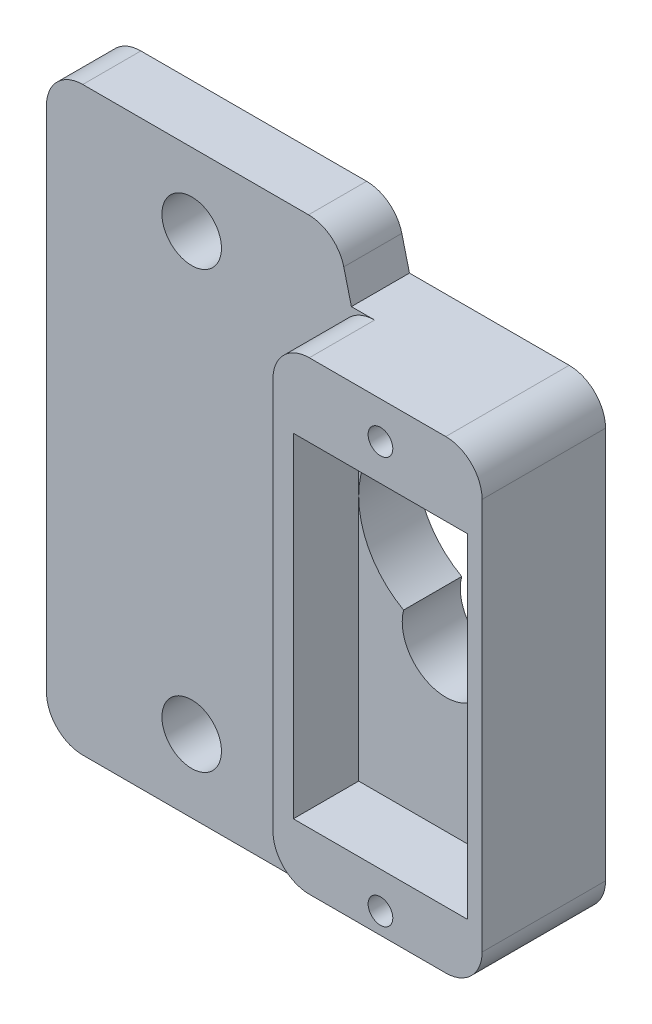
ISO-10303-21;
HEADER;
FILE_DESCRIPTION(('STEP AP214'),'2;1');
FILE_NAME('part.step','',(''),(''),'','','');
FILE_SCHEMA(('AUTOMOTIVE_DESIGN { 1 0 10303 214 1 1 1 1 }'));
ENDSEC;
DATA;
#1=APPLICATION_CONTEXT('core data for automotive mechanical design processes');
#2=APPLICATION_PROTOCOL_DEFINITION('international standard','automotive_design',2000,#1);
#3=PRODUCT_CONTEXT('',#1,'mechanical');
#4=PRODUCT('Part','Part','',(#3));
#5=PRODUCT_RELATED_PRODUCT_CATEGORY('part','',(#4));
#6=PRODUCT_DEFINITION_FORMATION('','',#4);
#7=PRODUCT_DEFINITION_CONTEXT('part definition',#1,'design');
#8=PRODUCT_DEFINITION('design','',#6,#7);
#9=PRODUCT_DEFINITION_SHAPE('','',#8);
#10=(LENGTH_UNIT() NAMED_UNIT(*) SI_UNIT(.MILLI.,.METRE.));
#11=(NAMED_UNIT(*) PLANE_ANGLE_UNIT() SI_UNIT($,.RADIAN.));
#12=(NAMED_UNIT(*) SI_UNIT($,.STERADIAN.) SOLID_ANGLE_UNIT());
#13=UNCERTAINTY_MEASURE_WITH_UNIT(LENGTH_MEASURE(1.E-05),#10,'distance_accuracy_value','');
#14=(GEOMETRIC_REPRESENTATION_CONTEXT(3) GLOBAL_UNCERTAINTY_ASSIGNED_CONTEXT((#13)) GLOBAL_UNIT_ASSIGNED_CONTEXT((#10,
#11,#12)) REPRESENTATION_CONTEXT('',''));
#15=CARTESIAN_POINT('',(0.,0.,0.));
#16=DIRECTION('',(0.,0.,1.));
#17=DIRECTION('',(1.,0.,0.));
#18=AXIS2_PLACEMENT_3D('',#15,#16,#17);
#19=CARTESIAN_POINT('',(40.,0.,4.));
#20=DIRECTION('',(0.,0.,1.));
#21=DIRECTION('',(-1.,0.,0.));
#22=AXIS2_PLACEMENT_3D('',#19,#20,#21);
#23=PLANE('',#22);
#24=CARTESIAN_POINT('',(47.5,4.95,4.));
#25=DIRECTION('',(0.,0.,-1.));
#26=DIRECTION('',(-1.,0.,0.));
#27=AXIS2_PLACEMENT_3D('',#24,#25,#26);
#28=CIRCLE('',#27,6.);
#29=CARTESIAN_POINT('',(47.5,10.95,4.));
#30=VERTEX_POINT('',#29);
#31=CARTESIAN_POINT('',(41.5,4.95,4.));
#32=VERTEX_POINT('',#31);
#33=EDGE_CURVE('E841',#30,#32,#28,.F.);
#34=ORIENTED_EDGE('',*,*,#33,.F.);
#35=DIRECTION('',(1.,0.,0.));
#36=VECTOR('',#35,1.);
#37=CARTESIAN_POINT('',(40.,10.95,4.));
#38=LINE('',#37,#36);
#39=CARTESIAN_POINT('',(41.5,10.95,4.));
#40=VERTEX_POINT('',#39);
#41=EDGE_CURVE('E268',#40,#30,#38,.T.);
#42=ORIENTED_EDGE('',*,*,#41,.F.);
#43=DIRECTION('',(0.,1.,0.));
#44=VECTOR('',#43,1.);
#45=CARTESIAN_POINT('',(41.5,0.,4.));
#46=LINE('',#45,#44);
#47=EDGE_CURVE('E276',#32,#40,#46,.T.);
#48=ORIENTED_EDGE('',*,*,#47,.F.);
#49=EDGE_LOOP('',(#34,#42,#48));
#50=FACE_BOUND('',#49,.T.);
#51=ADVANCED_FACE('F43',(#50),#23,.T.);
#52=CARTESIAN_POINT('',(53.5,4.95,4.));
#53=VERTEX_POINT('',#52);
#54=EDGE_CURVE('E302',#53,#30,#28,.F.);
#55=ORIENTED_EDGE('',*,*,#54,.F.);
#56=DIRECTION('',(0.,1.,0.));
#57=VECTOR('',#56,1.);
#58=CARTESIAN_POINT('',(53.5,0.,4.));
#59=LINE('',#58,#57);
#60=CARTESIAN_POINT('',(53.5,10.95,4.));
#61=VERTEX_POINT('',#60);
#62=EDGE_CURVE('E269',#53,#61,#59,.T.);
#63=ORIENTED_EDGE('',*,*,#62,.T.);
#64=EDGE_CURVE('E273',#30,#61,#38,.T.);
#65=ORIENTED_EDGE('',*,*,#64,.F.);
#66=EDGE_LOOP('',(#55,#63,#65));
#67=FACE_BOUND('',#66,.T.);
#68=ADVANCED_FACE('F513',(#67),#23,.T.);
#69=CARTESIAN_POINT('',(30.,-15.,4.));
#70=DIRECTION('',(0.,0.,-1.));
#71=DIRECTION('',(-1.,0.,0.));
#72=AXIS2_PLACEMENT_3D('',#69,#70,#71);
#73=CIRCLE('',#72,2.05);
#74=CARTESIAN_POINT('',(27.95,-15.,4.));
#75=VERTEX_POINT('',#74);
#76=EDGE_CURVE('E326',#75,#75,#73,.F.);
#77=ORIENTED_EDGE('',*,*,#76,.F.);
#78=EDGE_LOOP('',(#77));
#79=FACE_BOUND('',#78,.T.);
#80=CARTESIAN_POINT('',(30.,15.,4.));
#81=DIRECTION('',(0.,0.,-1.));
#82=DIRECTION('',(-1.,0.,0.));
#83=AXIS2_PLACEMENT_3D('',#80,#81,#82);
#84=CIRCLE('',#83,2.05);
#85=CARTESIAN_POINT('',(27.95,15.,4.));
#86=VERTEX_POINT('',#85);
#87=EDGE_CURVE('E323',#86,#86,#84,.T.);
#88=ORIENTED_EDGE('',*,*,#87,.T.);
#89=EDGE_LOOP('',(#88));
#90=FACE_BOUND('',#89,.T.);
#91=DIRECTION('',(-1.,0.,0.));
#92=VECTOR('',#91,1.);
#93=CARTESIAN_POINT('',(40.,20.,4.));
#94=LINE('',#93,#92);
#95=CARTESIAN_POINT('',(38.048058983989,20.,4.));
#96=VERTEX_POINT('',#95);
#97=CARTESIAN_POINT('',(22.5,20.,4.));
#98=VERTEX_POINT('',#97);
#99=EDGE_CURVE('E311',#96,#98,#94,.T.);
#100=ORIENTED_EDGE('',*,*,#99,.T.);
#101=CARTESIAN_POINT('',(22.5,17.5,4.));
#102=DIRECTION('',(0.,0.,-1.));
#103=DIRECTION('',(-1.,0.,0.));
#104=AXIS2_PLACEMENT_3D('',#101,#102,#103);
#105=CIRCLE('',#104,2.5);
#106=CARTESIAN_POINT('',(20.,17.5,4.));
#107=VERTEX_POINT('',#106);
#108=EDGE_CURVE('E397',#107,#98,#105,.T.);
#109=ORIENTED_EDGE('',*,*,#108,.F.);
#110=DIRECTION('',(0.,-1.,0.));
#111=VECTOR('',#110,1.);
#112=CARTESIAN_POINT('',(20.,0.,4.));
#113=LINE('',#112,#111);
#114=CARTESIAN_POINT('',(20.,-17.5,4.));
#115=VERTEX_POINT('',#114);
#116=EDGE_CURVE('E308',#107,#115,#113,.T.);
#117=ORIENTED_EDGE('',*,*,#116,.T.);
#118=CARTESIAN_POINT('',(22.5,-17.5,4.));
#119=DIRECTION('',(0.,0.,-1.));
#120=DIRECTION('',(-1.,0.,0.));
#121=AXIS2_PLACEMENT_3D('',#118,#119,#120);
#122=CIRCLE('',#121,2.5);
#123=CARTESIAN_POINT('',(22.5,-20.,4.));
#124=VERTEX_POINT('',#123);
#125=EDGE_CURVE('E394',#124,#115,#122,.T.);
#126=ORIENTED_EDGE('',*,*,#125,.F.);
#127=DIRECTION('',(1.,0.,0.));
#128=VECTOR('',#127,1.);
#129=CARTESIAN_POINT('',(40.,-20.,4.));
#130=LINE('',#129,#128);
#131=CARTESIAN_POINT('',(38.048058983989,-20.,4.));
#132=VERTEX_POINT('',#131);
#133=EDGE_CURVE('E305',#124,#132,#130,.T.);
#134=ORIENTED_EDGE('',*,*,#133,.T.);
#135=CARTESIAN_POINT('',(38.048058983989,-17.5,4.));
#136=DIRECTION('',(0.,0.,-1.));
#137=DIRECTION('',(-1.,0.,0.));
#138=AXIS2_PLACEMENT_3D('',#135,#136,#137);
#139=CIRCLE('',#138,2.5);
#140=CARTESIAN_POINT('',(40.4734152343523,-18.1063390625908,4.));
#141=VERTEX_POINT('',#140);
#142=EDGE_CURVE('E400',#141,#132,#139,.T.);
#143=ORIENTED_EDGE('',*,*,#142,.F.);
#144=DIRECTION('',(0.242535625036332,0.970142500145332,0.));
#145=VECTOR('',#144,1.);
#146=CARTESIAN_POINT('',(44.7058823529412,-1.17647058823529,4.));
#147=LINE('',#146,#145);
#148=CARTESIAN_POINT('',(41.,-16.,4.));
#149=VERTEX_POINT('',#148);
#150=EDGE_CURVE('E301',#141,#149,#147,.T.);
#151=ORIENTED_EDGE('',*,*,#150,.T.);
#152=DIRECTION('',(1.,0.,0.));
#153=VECTOR('',#152,1.);
#154=CARTESIAN_POINT('',(40.,-16.,4.));
#155=LINE('',#154,#153);
#156=CARTESIAN_POINT('',(42.6,-16.,4.));
#157=VERTEX_POINT('',#156);
#158=EDGE_CURVE('E320',#149,#157,#155,.T.);
#159=ORIENTED_EDGE('',*,*,#158,.T.);
#160=CARTESIAN_POINT('',(42.6,-13.5,4.));
#161=DIRECTION('',(0.,0.,-1.));
#162=DIRECTION('',(-1.,0.,0.));
#163=AXIS2_PLACEMENT_3D('',#160,#161,#162);
#164=CIRCLE('',#163,2.5);
#165=CARTESIAN_POINT('',(40.1,-13.5,4.));
#166=VERTEX_POINT('',#165);
#167=EDGE_CURVE('E236',#166,#157,#164,.F.);
#168=ORIENTED_EDGE('',*,*,#167,.F.);
#169=DIRECTION('',(0.,-1.,0.));
#170=VECTOR('',#169,1.);
#171=CARTESIAN_POINT('',(40.1,0.,4.));
#172=LINE('',#171,#170);
#173=CARTESIAN_POINT('',(40.1,13.5,4.));
#174=VERTEX_POINT('',#173);
#175=EDGE_CURVE('E275',#174,#166,#172,.T.);
#176=ORIENTED_EDGE('',*,*,#175,.F.);
#177=CARTESIAN_POINT('',(42.6,13.5,4.));
#178=DIRECTION('',(0.,0.,-1.));
#179=DIRECTION('',(-1.,0.,0.));
#180=AXIS2_PLACEMENT_3D('',#177,#178,#179);
#181=CIRCLE('',#180,2.5);
#182=CARTESIAN_POINT('',(42.6,16.,4.));
#183=VERTEX_POINT('',#182);
#184=EDGE_CURVE('E239',#174,#183,#181,.T.);
#185=ORIENTED_EDGE('',*,*,#184,.T.);
#186=DIRECTION('',(1.,0.,0.));
#187=VECTOR('',#186,1.);
#188=CARTESIAN_POINT('',(40.,16.,4.));
#189=LINE('',#188,#187);
#190=CARTESIAN_POINT('',(41.,16.,4.));
#191=VERTEX_POINT('',#190);
#192=EDGE_CURVE('E317',#191,#183,#189,.T.);
#193=ORIENTED_EDGE('',*,*,#192,.F.);
#194=DIRECTION('',(0.242535625036332,-0.970142500145332,0.));
#195=VECTOR('',#194,1.);
#196=CARTESIAN_POINT('',(44.7058823529412,1.17647058823529,4.));
#197=LINE('',#196,#195);
#198=CARTESIAN_POINT('',(40.4734152343523,18.1063390625908,4.));
#199=VERTEX_POINT('',#198);
#200=EDGE_CURVE('E314',#199,#191,#197,.T.);
#201=ORIENTED_EDGE('',*,*,#200,.F.);
#202=CARTESIAN_POINT('',(38.048058983989,17.5,4.));
#203=DIRECTION('',(0.,0.,-1.));
#204=DIRECTION('',(-1.,0.,0.));
#205=AXIS2_PLACEMENT_3D('',#202,#203,#204);
#206=CIRCLE('',#205,2.5);
#207=EDGE_CURVE('E403',#96,#199,#206,.T.);
#208=ORIENTED_EDGE('',*,*,#207,.F.);
#209=EDGE_LOOP('',(#100,#109,#117,#126,#134,#143,#151,#159,#168,#176,#185,#193,#201,#208));
#210=FACE_BOUND('',#209,.T.);
#211=ADVANCED_FACE('F444',(#79,#90,#210),#23,.T.);
#212=CARTESIAN_POINT('',(44.7058823529412,-1.17647058823529,4.));
#213=DIRECTION('',(0.970142500145332,-0.242535625036332,0.));
#214=DIRECTION('',(-0.242535625036332,-0.970142500145332,0.));
#215=AXIS2_PLACEMENT_3D('',#212,#213,#214);
#216=PLANE('',#215);
#217=DIRECTION('',(0.242535625036332,0.970142500145332,0.));
#218=VECTOR('',#217,1.);
#219=CARTESIAN_POINT('',(44.7058823529412,-1.17647058823529,0.));
#220=LINE('',#219,#218);
#221=CARTESIAN_POINT('',(40.4734152343523,-18.1063390625908,0.));
#222=VERTEX_POINT('',#221);
#223=CARTESIAN_POINT('',(41.,-16.,0.));
#224=VERTEX_POINT('',#223);
#225=EDGE_CURVE('E334',#222,#224,#220,.T.);
#226=ORIENTED_EDGE('',*,*,#225,.T.);
#227=DIRECTION('',(0.,0.,-1.));
#228=VECTOR('',#227,1.);
#229=CARTESIAN_POINT('',(41.,-16.,4.));
#230=LINE('',#229,#228);
#231=EDGE_CURVE('E363',#149,#224,#230,.T.);
#232=ORIENTED_EDGE('',*,*,#231,.F.);
#233=ORIENTED_EDGE('',*,*,#150,.F.);
#234=DIRECTION('',(0.,0.,-1.));
#235=VECTOR('',#234,1.);
#236=CARTESIAN_POINT('',(40.4734152343523,-18.1063390625908,4.));
#237=LINE('',#236,#235);
#238=EDGE_CURVE('E411',#222,#141,#237,.F.);
#239=ORIENTED_EDGE('',*,*,#238,.F.);
#240=EDGE_LOOP('',(#226,#232,#233,#239));
#241=FACE_BOUND('',#240,.T.);
#242=ADVANCED_FACE('F480',(#241),#216,.T.);
#243=CARTESIAN_POINT('',(40.,-20.,4.));
#244=DIRECTION('',(0.,-1.,0.));
#245=DIRECTION('',(0.,0.,-1.));
#246=AXIS2_PLACEMENT_3D('',#243,#244,#245);
#247=PLANE('',#246);
#248=ORIENTED_EDGE('',*,*,#133,.F.);
#249=DIRECTION('',(0.,0.,-1.));
#250=VECTOR('',#249,1.);
#251=CARTESIAN_POINT('',(22.5,-20.,4.));
#252=LINE('',#251,#250);
#253=CARTESIAN_POINT('',(22.5,-20.,0.));
#254=VERTEX_POINT('',#253);
#255=EDGE_CURVE('E406',#254,#124,#252,.F.);
#256=ORIENTED_EDGE('',*,*,#255,.F.);
#257=DIRECTION('',(1.,0.,0.));
#258=VECTOR('',#257,1.);
#259=CARTESIAN_POINT('',(40.,-20.,0.));
#260=LINE('',#259,#258);
#261=CARTESIAN_POINT('',(38.048058983989,-20.,0.));
#262=VERTEX_POINT('',#261);
#263=EDGE_CURVE('E337',#254,#262,#260,.T.);
#264=ORIENTED_EDGE('',*,*,#263,.T.);
#265=DIRECTION('',(0.,0.,-1.));
#266=VECTOR('',#265,1.);
#267=CARTESIAN_POINT('',(38.048058983989,-20.,4.));
#268=LINE('',#267,#266);
#269=EDGE_CURVE('E408',#132,#262,#268,.T.);
#270=ORIENTED_EDGE('',*,*,#269,.F.);
#271=EDGE_LOOP('',(#248,#256,#264,#270));
#272=FACE_BOUND('',#271,.T.);
#273=ADVANCED_FACE('F441',(#272),#247,.T.);
#274=CARTESIAN_POINT('',(20.,0.,4.));
#275=DIRECTION('',(-1.,0.,0.));
#276=DIRECTION('',(0.,0.,-1.));
#277=AXIS2_PLACEMENT_3D('',#274,#275,#276);
#278=PLANE('',#277);
#279=DIRECTION('',(0.,-1.,0.));
#280=VECTOR('',#279,1.);
#281=CARTESIAN_POINT('',(20.,0.,0.));
#282=LINE('',#281,#280);
#283=CARTESIAN_POINT('',(20.,17.5,0.));
#284=VERTEX_POINT('',#283);
#285=CARTESIAN_POINT('',(20.,-17.5,0.));
#286=VERTEX_POINT('',#285);
#287=EDGE_CURVE('E340',#284,#286,#282,.T.);
#288=ORIENTED_EDGE('',*,*,#287,.T.);
#289=DIRECTION('',(0.,0.,-1.));
#290=VECTOR('',#289,1.);
#291=CARTESIAN_POINT('',(20.,-17.5,4.));
#292=LINE('',#291,#290);
#293=EDGE_CURVE('E51',#115,#286,#292,.T.);
#294=ORIENTED_EDGE('',*,*,#293,.F.);
#295=ORIENTED_EDGE('',*,*,#116,.F.);
#296=DIRECTION('',(0.,0.,-1.));
#297=VECTOR('',#296,1.);
#298=CARTESIAN_POINT('',(20.,17.5,4.));
#299=LINE('',#298,#297);
#300=EDGE_CURVE('E11',#284,#107,#299,.F.);
#301=ORIENTED_EDGE('',*,*,#300,.F.);
#302=EDGE_LOOP('',(#288,#294,#295,#301));
#303=FACE_BOUND('',#302,.T.);
#304=ADVANCED_FACE('F432',(#303),#278,.T.);
#305=CARTESIAN_POINT('',(40.,20.,4.));
#306=DIRECTION('',(0.,1.,0.));
#307=DIRECTION('',(0.,0.,1.));
#308=AXIS2_PLACEMENT_3D('',#305,#306,#307);
#309=PLANE('',#308);
#310=DIRECTION('',(-1.,0.,0.));
#311=VECTOR('',#310,1.);
#312=CARTESIAN_POINT('',(40.,20.,0.));
#313=LINE('',#312,#311);
#314=CARTESIAN_POINT('',(38.048058983989,20.,0.));
#315=VERTEX_POINT('',#314);
#316=CARTESIAN_POINT('',(22.5,20.,0.));
#317=VERTEX_POINT('',#316);
#318=EDGE_CURVE('E343',#315,#317,#313,.T.);
#319=ORIENTED_EDGE('',*,*,#318,.T.);
#320=DIRECTION('',(0.,0.,-1.));
#321=VECTOR('',#320,1.);
#322=CARTESIAN_POINT('',(22.5,20.,4.));
#323=LINE('',#322,#321);
#324=EDGE_CURVE('E389',#98,#317,#323,.T.);
#325=ORIENTED_EDGE('',*,*,#324,.F.);
#326=ORIENTED_EDGE('',*,*,#99,.F.);
#327=DIRECTION('',(0.,0.,-1.));
#328=VECTOR('',#327,1.);
#329=CARTESIAN_POINT('',(38.048058983989,20.,4.));
#330=LINE('',#329,#328);
#331=EDGE_CURVE('E392',#315,#96,#330,.F.);
#332=ORIENTED_EDGE('',*,*,#331,.F.);
#333=EDGE_LOOP('',(#319,#325,#326,#332));
#334=FACE_BOUND('',#333,.T.);
#335=ADVANCED_FACE('F452',(#334),#309,.T.);
#336=CARTESIAN_POINT('',(44.7058823529412,1.17647058823529,4.));
#337=DIRECTION('',(-0.970142500145332,-0.242535625036332,0.));
#338=DIRECTION('',(-0.242535625036332,0.970142500145332,0.));
#339=AXIS2_PLACEMENT_3D('',#336,#337,#338);
#340=PLANE('',#339);
#341=ORIENTED_EDGE('',*,*,#200,.T.);
#342=DIRECTION('',(0.,0.,-1.));
#343=VECTOR('',#342,1.);
#344=CARTESIAN_POINT('',(41.,16.,4.));
#345=LINE('',#344,#343);
#346=CARTESIAN_POINT('',(41.,16.,0.));
#347=VERTEX_POINT('',#346);
#348=EDGE_CURVE('E366',#191,#347,#345,.T.);
#349=ORIENTED_EDGE('',*,*,#348,.T.);
#350=DIRECTION('',(0.242535625036332,-0.970142500145332,0.));
#351=VECTOR('',#350,1.);
#352=CARTESIAN_POINT('',(44.7058823529412,1.17647058823529,0.));
#353=LINE('',#352,#351);
#354=CARTESIAN_POINT('',(40.4734152343523,18.1063390625908,0.));
#355=VERTEX_POINT('',#354);
#356=EDGE_CURVE('E346',#355,#347,#353,.T.);
#357=ORIENTED_EDGE('',*,*,#356,.F.);
#358=DIRECTION('',(0.,0.,-1.));
#359=VECTOR('',#358,1.);
#360=CARTESIAN_POINT('',(40.4734152343523,18.1063390625908,0.));
#361=LINE('',#360,#359);
#362=EDGE_CURVE('E374',#199,#355,#361,.T.);
#363=ORIENTED_EDGE('',*,*,#362,.F.);
#364=EDGE_LOOP('',(#341,#349,#357,#363));
#365=FACE_BOUND('',#364,.T.);
#366=ADVANCED_FACE('F458',(#365),#340,.F.);
#367=CARTESIAN_POINT('',(40.,16.,4.));
#368=DIRECTION('',(0.,-1.,0.));
#369=DIRECTION('',(-1.,0.,0.));
#370=AXIS2_PLACEMENT_3D('',#367,#368,#369);
#371=PLANE('',#370);
#372=DIRECTION('',(1.,0.,0.));
#373=VECTOR('',#372,1.);
#374=CARTESIAN_POINT('',(40.,16.,0.));
#375=LINE('',#374,#373);
#376=CARTESIAN_POINT('',(52.,16.,0.));
#377=VERTEX_POINT('',#376);
#378=EDGE_CURVE('E349',#347,#377,#375,.T.);
#379=ORIENTED_EDGE('',*,*,#378,.F.);
#380=ORIENTED_EDGE('',*,*,#348,.F.);
#381=ORIENTED_EDGE('',*,*,#192,.T.);
#382=DIRECTION('',(0.,0.,-1.));
#383=VECTOR('',#382,1.);
#384=CARTESIAN_POINT('',(42.6,16.,8.5));
#385=LINE('',#384,#383);
#386=CARTESIAN_POINT('',(42.6,16.,8.5));
#387=VERTEX_POINT('',#386);
#388=EDGE_CURVE('E284',#387,#183,#385,.T.);
#389=ORIENTED_EDGE('',*,*,#388,.F.);
#390=DIRECTION('',(1.,0.,0.));
#391=VECTOR('',#390,1.);
#392=CARTESIAN_POINT('',(40.,16.,8.5));
#393=LINE('',#392,#391);
#394=CARTESIAN_POINT('',(52.,16.,8.5));
#395=VERTEX_POINT('',#394);
#396=EDGE_CURVE('E253',#387,#395,#393,.T.);
#397=ORIENTED_EDGE('',*,*,#396,.T.);
#398=DIRECTION('',(0.,0.,-1.));
#399=VECTOR('',#398,1.);
#400=CARTESIAN_POINT('',(52.,16.,4.));
#401=LINE('',#400,#399);
#402=EDGE_CURVE('E423',#377,#395,#401,.F.);
#403=ORIENTED_EDGE('',*,*,#402,.F.);
#404=EDGE_LOOP('',(#379,#380,#381,#389,#397,#403));
#405=FACE_BOUND('',#404,.T.);
#406=ADVANCED_FACE('F461',(#405),#371,.F.);
#407=CARTESIAN_POINT('',(54.5,0.,4.));
#408=DIRECTION('',(-1.,0.,0.));
#409=DIRECTION('',(0.,0.,-1.));
#410=AXIS2_PLACEMENT_3D('',#407,#408,#409);
#411=PLANE('',#410);
#412=DIRECTION('',(0.,-1.,0.));
#413=VECTOR('',#412,1.);
#414=CARTESIAN_POINT('',(54.5,0.,0.));
#415=LINE('',#414,#413);
#416=CARTESIAN_POINT('',(54.5,13.5,0.));
#417=VERTEX_POINT('',#416);
#418=CARTESIAN_POINT('',(54.5,-13.5,0.));
#419=VERTEX_POINT('',#418);
#420=EDGE_CURVE('E352',#417,#419,#415,.T.);
#421=ORIENTED_EDGE('',*,*,#420,.F.);
#422=DIRECTION('',(0.,0.,-1.));
#423=VECTOR('',#422,1.);
#424=CARTESIAN_POINT('',(54.5,13.5,4.));
#425=LINE('',#424,#423);
#426=CARTESIAN_POINT('',(54.5,13.5,8.5));
#427=VERTEX_POINT('',#426);
#428=EDGE_CURVE('E416',#427,#417,#425,.T.);
#429=ORIENTED_EDGE('',*,*,#428,.F.);
#430=DIRECTION('',(0.,-1.,0.));
#431=VECTOR('',#430,1.);
#432=CARTESIAN_POINT('',(54.5,0.,8.5));
#433=LINE('',#432,#431);
#434=CARTESIAN_POINT('',(54.5,-13.5,8.5));
#435=VERTEX_POINT('',#434);
#436=EDGE_CURVE('E256',#427,#435,#433,.T.);
#437=ORIENTED_EDGE('',*,*,#436,.T.);
#438=DIRECTION('',(0.,0.,-1.));
#439=VECTOR('',#438,1.);
#440=CARTESIAN_POINT('',(54.5,-13.5,8.5));
#441=LINE('',#440,#439);
#442=EDGE_CURVE('E419',#419,#435,#441,.F.);
#443=ORIENTED_EDGE('',*,*,#442,.F.);
#444=EDGE_LOOP('',(#421,#429,#437,#443));
#445=FACE_BOUND('',#444,.T.);
#446=ADVANCED_FACE('F470',(#445),#411,.F.);
#447=CARTESIAN_POINT('',(47.5,-1.05,4.));
#448=DIRECTION('',(0.,0.,-1.));
#449=DIRECTION('',(1.,0.,0.));
#450=AXIS2_PLACEMENT_3D('',#447,#448,#449);
#451=CYLINDRICAL_SURFACE('',#450,3.);
#452=CARTESIAN_POINT('',(47.5,-1.05,0.));
#453=DIRECTION('',(0.,0.,-1.));
#454=DIRECTION('',(-1.,0.,0.));
#455=AXIS2_PLACEMENT_3D('',#452,#453,#454);
#456=CIRCLE('',#455,3.);
#457=CARTESIAN_POINT('',(50.4047375096556,-0.300000000000001,0.));
#458=VERTEX_POINT('',#457);
#459=CARTESIAN_POINT('',(44.5952624903444,-0.3,0.));
#460=VERTEX_POINT('',#459);
#461=EDGE_CURVE('E288',#458,#460,#456,.T.);
#462=ORIENTED_EDGE('',*,*,#461,.T.);
#463=DIRECTION('',(0.,0.,-1.));
#464=VECTOR('',#463,1.);
#465=CARTESIAN_POINT('',(44.5952624903444,-0.3,4.));
#466=LINE('',#465,#464);
#467=CARTESIAN_POINT('',(44.5952624903444,-0.3,4.));
#468=VERTEX_POINT('',#467);
#469=EDGE_CURVE('E329',#468,#460,#466,.T.);
#470=ORIENTED_EDGE('',*,*,#469,.F.);
#471=CARTESIAN_POINT('',(47.5,-1.05,4.));
#472=DIRECTION('',(0.,0.,-1.));
#473=DIRECTION('',(-1.,0.,0.));
#474=AXIS2_PLACEMENT_3D('',#471,#472,#473);
#475=CIRCLE('',#474,3.);
#476=CARTESIAN_POINT('',(50.4047375096556,-0.300000000000001,4.));
#477=VERTEX_POINT('',#476);
#478=EDGE_CURVE('E293',#477,#468,#475,.T.);
#479=ORIENTED_EDGE('',*,*,#478,.F.);
#480=DIRECTION('',(0.,0.,-1.));
#481=VECTOR('',#480,1.);
#482=CARTESIAN_POINT('',(50.4047375096556,-0.300000000000001,4.));
#483=LINE('',#482,#481);
#484=EDGE_CURVE('E367',#477,#458,#483,.T.);
#485=ORIENTED_EDGE('',*,*,#484,.T.);
#486=EDGE_LOOP('',(#462,#470,#479,#485));
#487=FACE_BOUND('',#486,.T.);
#488=ADVANCED_FACE('F548',(#487),#451,.F.);
#489=CARTESIAN_POINT('',(30.,15.,4.));
#490=DIRECTION('',(0.,0.,-1.));
#491=DIRECTION('',(1.,0.,0.));
#492=AXIS2_PLACEMENT_3D('',#489,#490,#491);
#493=CYLINDRICAL_SURFACE('',#492,2.05);
#494=ORIENTED_EDGE('',*,*,#87,.F.);
#495=EDGE_LOOP('',(#494));
#496=FACE_BOUND('',#495,.T.);
#497=CARTESIAN_POINT('',(30.,15.,0.));
#498=DIRECTION('',(0.,0.,-1.));
#499=DIRECTION('',(-1.,0.,0.));
#500=AXIS2_PLACEMENT_3D('',#497,#498,#499);
#501=CIRCLE('',#500,2.05);
#502=CARTESIAN_POINT('',(27.95,15.,0.));
#503=VERTEX_POINT('',#502);
#504=EDGE_CURVE('E358',#503,#503,#501,.T.);
#505=ORIENTED_EDGE('',*,*,#504,.T.);
#506=EDGE_LOOP('',(#505));
#507=FACE_BOUND('',#506,.T.);
#508=ADVANCED_FACE('F545',(#496,#507),#493,.F.);
#509=CARTESIAN_POINT('',(40.,-16.,4.));
#510=DIRECTION('',(0.,-1.,0.));
#511=DIRECTION('',(-1.,0.,0.));
#512=AXIS2_PLACEMENT_3D('',#509,#510,#511);
#513=PLANE('',#512);
#514=DIRECTION('',(-1.,0.,0.));
#515=VECTOR('',#514,1.);
#516=CARTESIAN_POINT('',(40.,-16.,8.5));
#517=LINE('',#516,#515);
#518=CARTESIAN_POINT('',(52.,-16.,8.5));
#519=VERTEX_POINT('',#518);
#520=CARTESIAN_POINT('',(42.6,-16.,8.5));
#521=VERTEX_POINT('',#520);
#522=EDGE_CURVE('E259',#519,#521,#517,.T.);
#523=ORIENTED_EDGE('',*,*,#522,.T.);
#524=DIRECTION('',(0.,0.,-1.));
#525=VECTOR('',#524,1.);
#526=CARTESIAN_POINT('',(42.6,-16.,8.5));
#527=LINE('',#526,#525);
#528=EDGE_CURVE('E282',#521,#157,#527,.T.);
#529=ORIENTED_EDGE('',*,*,#528,.T.);
#530=ORIENTED_EDGE('',*,*,#158,.F.);
#531=ORIENTED_EDGE('',*,*,#231,.T.);
#532=DIRECTION('',(1.,0.,0.));
#533=VECTOR('',#532,1.);
#534=CARTESIAN_POINT('',(40.,-16.,0.));
#535=LINE('',#534,#533);
#536=CARTESIAN_POINT('',(52.,-16.,0.));
#537=VERTEX_POINT('',#536);
#538=EDGE_CURVE('E355',#224,#537,#535,.T.);
#539=ORIENTED_EDGE('',*,*,#538,.T.);
#540=DIRECTION('',(0.,0.,-1.));
#541=VECTOR('',#540,1.);
#542=CARTESIAN_POINT('',(52.,-16.,0.));
#543=LINE('',#542,#541);
#544=EDGE_CURVE('E413',#519,#537,#543,.T.);
#545=ORIENTED_EDGE('',*,*,#544,.F.);
#546=EDGE_LOOP('',(#523,#529,#530,#531,#539,#545));
#547=FACE_BOUND('',#546,.T.);
#548=ADVANCED_FACE('F476',(#547),#513,.T.);
#549=CARTESIAN_POINT('',(47.5,4.95,4.));
#550=DIRECTION('',(0.,0.,-1.));
#551=DIRECTION('',(1.,0.,0.));
#552=AXIS2_PLACEMENT_3D('',#549,#550,#551);
#553=CYLINDRICAL_SURFACE('',#552,6.);
#554=CARTESIAN_POINT('',(47.5,4.95,0.));
#555=DIRECTION('',(0.,0.,-1.));
#556=DIRECTION('',(-1.,0.,0.));
#557=AXIS2_PLACEMENT_3D('',#554,#555,#556);
#558=CIRCLE('',#557,6.);
#559=EDGE_CURVE('E332',#458,#460,#558,.F.);
#560=ORIENTED_EDGE('',*,*,#559,.F.);
#561=ORIENTED_EDGE('',*,*,#484,.F.);
#562=EDGE_CURVE('E298',#477,#53,#28,.F.);
#563=ORIENTED_EDGE('',*,*,#562,.T.);
#564=ORIENTED_EDGE('',*,*,#54,.T.);
#565=ORIENTED_EDGE('',*,*,#33,.T.);
#566=EDGE_CURVE('E296',#32,#468,#28,.F.);
#567=ORIENTED_EDGE('',*,*,#566,.T.);
#568=ORIENTED_EDGE('',*,*,#469,.T.);
#569=EDGE_LOOP('',(#560,#561,#563,#564,#565,#567,#568));
#570=FACE_BOUND('',#569,.T.);
#571=ADVANCED_FACE('F532',(#570),#553,.F.);
#572=CARTESIAN_POINT('',(30.,-15.,4.));
#573=DIRECTION('',(0.,0.,-1.));
#574=DIRECTION('',(1.,0.,0.));
#575=AXIS2_PLACEMENT_3D('',#572,#573,#574);
#576=CYLINDRICAL_SURFACE('',#575,2.05);
#577=ORIENTED_EDGE('',*,*,#76,.T.);
#578=EDGE_LOOP('',(#577));
#579=FACE_BOUND('',#578,.T.);
#580=CARTESIAN_POINT('',(30.,-15.,0.));
#581=DIRECTION('',(0.,0.,-1.));
#582=DIRECTION('',(-1.,0.,0.));
#583=AXIS2_PLACEMENT_3D('',#580,#581,#582);
#584=CIRCLE('',#583,2.05);
#585=CARTESIAN_POINT('',(27.95,-15.,0.));
#586=VERTEX_POINT('',#585);
#587=EDGE_CURVE('E297',#586,#586,#584,.F.);
#588=ORIENTED_EDGE('',*,*,#587,.F.);
#589=EDGE_LOOP('',(#588));
#590=FACE_BOUND('',#589,.T.);
#591=ADVANCED_FACE('F525',(#579,#590),#576,.F.);
#592=DIRECTION('',(1.,0.,0.));
#593=VECTOR('',#592,1.);
#594=CARTESIAN_POINT('',(40.,-12.05,4.));
#595=LINE('',#594,#593);
#596=CARTESIAN_POINT('',(41.5,-12.05,4.));
#597=VERTEX_POINT('',#596);
#598=CARTESIAN_POINT('',(53.5,-12.05,4.));
#599=VERTEX_POINT('',#598);
#600=EDGE_CURVE('E264',#597,#599,#595,.T.);
#601=ORIENTED_EDGE('',*,*,#600,.T.);
#602=EDGE_CURVE('E227',#599,#53,#59,.T.);
#603=ORIENTED_EDGE('',*,*,#602,.T.);
#604=ORIENTED_EDGE('',*,*,#562,.F.);
#605=ORIENTED_EDGE('',*,*,#478,.T.);
#606=ORIENTED_EDGE('',*,*,#566,.F.);
#607=EDGE_CURVE('E272',#597,#32,#46,.T.);
#608=ORIENTED_EDGE('',*,*,#607,.F.);
#609=EDGE_LOOP('',(#601,#603,#604,#605,#606,#608));
#610=FACE_BOUND('',#609,.T.);
#611=ADVANCED_FACE('F516',(#610),#23,.T.);
#612=CARTESIAN_POINT('',(40.,0.,0.));
#613=DIRECTION('',(0.,0.,1.));
#614=DIRECTION('',(-1.,0.,0.));
#615=AXIS2_PLACEMENT_3D('',#612,#613,#614);
#616=PLANE('',#615);
#617=ORIENTED_EDGE('',*,*,#461,.F.);
#618=ORIENTED_EDGE('',*,*,#559,.T.);
#619=EDGE_LOOP('',(#617,#618));
#620=FACE_BOUND('',#619,.T.);
#621=ORIENTED_EDGE('',*,*,#356,.T.);
#622=ORIENTED_EDGE('',*,*,#378,.T.);
#623=CARTESIAN_POINT('',(52.,13.5,0.));
#624=DIRECTION('',(0.,0.,-1.));
#625=DIRECTION('',(-1.,0.,0.));
#626=AXIS2_PLACEMENT_3D('',#623,#624,#625);
#627=CIRCLE('',#626,2.5);
#628=EDGE_CURVE('E381',#417,#377,#627,.F.);
#629=ORIENTED_EDGE('',*,*,#628,.F.);
#630=ORIENTED_EDGE('',*,*,#420,.T.);
#631=CARTESIAN_POINT('',(52.,-13.5,0.));
#632=DIRECTION('',(0.,0.,-1.));
#633=DIRECTION('',(-1.,0.,0.));
#634=AXIS2_PLACEMENT_3D('',#631,#632,#633);
#635=CIRCLE('',#634,2.5);
#636=EDGE_CURVE('E383',#537,#419,#635,.F.);
#637=ORIENTED_EDGE('',*,*,#636,.F.);
#638=ORIENTED_EDGE('',*,*,#538,.F.);
#639=ORIENTED_EDGE('',*,*,#225,.F.);
#640=CARTESIAN_POINT('',(38.048058983989,-17.5,0.));
#641=DIRECTION('',(0.,0.,-1.));
#642=DIRECTION('',(-1.,0.,0.));
#643=AXIS2_PLACEMENT_3D('',#640,#641,#642);
#644=CIRCLE('',#643,2.5);
#645=EDGE_CURVE('E385',#262,#222,#644,.F.);
#646=ORIENTED_EDGE('',*,*,#645,.F.);
#647=ORIENTED_EDGE('',*,*,#263,.F.);
#648=CARTESIAN_POINT('',(22.5,-17.5,0.));
#649=DIRECTION('',(0.,0.,-1.));
#650=DIRECTION('',(-1.,0.,0.));
#651=AXIS2_PLACEMENT_3D('',#648,#649,#650);
#652=CIRCLE('',#651,2.5);
#653=EDGE_CURVE('E377',#286,#254,#652,.F.);
#654=ORIENTED_EDGE('',*,*,#653,.F.);
#655=ORIENTED_EDGE('',*,*,#287,.F.);
#656=CARTESIAN_POINT('',(22.5,17.5,0.));
#657=DIRECTION('',(0.,0.,-1.));
#658=DIRECTION('',(-1.,0.,0.));
#659=AXIS2_PLACEMENT_3D('',#656,#657,#658);
#660=CIRCLE('',#659,2.5);
#661=EDGE_CURVE('E379',#317,#284,#660,.F.);
#662=ORIENTED_EDGE('',*,*,#661,.F.);
#663=ORIENTED_EDGE('',*,*,#318,.F.);
#664=CARTESIAN_POINT('',(38.048058983989,17.5,0.));
#665=DIRECTION('',(0.,0.,-1.));
#666=DIRECTION('',(-1.,0.,0.));
#667=AXIS2_PLACEMENT_3D('',#664,#665,#666);
#668=CIRCLE('',#667,2.5);
#669=EDGE_CURVE('E387',#355,#315,#668,.F.);
#670=ORIENTED_EDGE('',*,*,#669,.F.);
#671=EDGE_LOOP('',(#621,#622,#629,#630,#637,#638,#639,#646,#647,#654,#655,#662,#663,#670));
#672=FACE_BOUND('',#671,.T.);
#673=ORIENTED_EDGE('',*,*,#504,.F.);
#674=EDGE_LOOP('',(#673));
#675=FACE_BOUND('',#674,.T.);
#676=ORIENTED_EDGE('',*,*,#587,.T.);
#677=EDGE_LOOP('',(#676));
#678=FACE_BOUND('',#677,.T.);
#679=ADVANCED_FACE('F434',(#620,#672,#675,#678),#616,.F.);
#680=CARTESIAN_POINT('',(40.1,0.,8.5));
#681=DIRECTION('',(-1.,0.,0.));
#682=DIRECTION('',(0.,1.,0.));
#683=AXIS2_PLACEMENT_3D('',#680,#681,#682);
#684=PLANE('',#683);
#685=ORIENTED_EDGE('',*,*,#175,.T.);
#686=DIRECTION('',(0.,0.,-1.));
#687=VECTOR('',#686,1.);
#688=CARTESIAN_POINT('',(40.1,-13.5,8.5));
#689=LINE('',#688,#687);
#690=CARTESIAN_POINT('',(40.1,-13.5,8.5));
#691=VERTEX_POINT('',#690);
#692=EDGE_CURVE('E231',#691,#166,#689,.T.);
#693=ORIENTED_EDGE('',*,*,#692,.F.);
#694=DIRECTION('',(0.,-1.,0.));
#695=VECTOR('',#694,1.);
#696=CARTESIAN_POINT('',(40.1,0.,8.5));
#697=LINE('',#696,#695);
#698=CARTESIAN_POINT('',(40.1,13.5,8.5));
#699=VERTEX_POINT('',#698);
#700=EDGE_CURVE('E248',#699,#691,#697,.T.);
#701=ORIENTED_EDGE('',*,*,#700,.F.);
#702=DIRECTION('',(0.,0.,-1.));
#703=VECTOR('',#702,1.);
#704=CARTESIAN_POINT('',(40.1,13.5,8.5));
#705=LINE('',#704,#703);
#706=EDGE_CURVE('E286',#699,#174,#705,.T.);
#707=ORIENTED_EDGE('',*,*,#706,.T.);
#708=EDGE_LOOP('',(#685,#693,#701,#707));
#709=FACE_BOUND('',#708,.T.);
#710=ADVANCED_FACE('F491',(#709),#684,.T.);
#711=CARTESIAN_POINT('',(42.6,13.5,8.5));
#712=DIRECTION('',(0.,0.,-1.));
#713=DIRECTION('',(1.,0.,0.));
#714=AXIS2_PLACEMENT_3D('',#711,#712,#713);
#715=CYLINDRICAL_SURFACE('',#714,2.5);
#716=ORIENTED_EDGE('',*,*,#184,.F.);
#717=ORIENTED_EDGE('',*,*,#706,.F.);
#718=CARTESIAN_POINT('',(42.6,13.5,8.5));
#719=DIRECTION('',(0.,0.,-1.));
#720=DIRECTION('',(-1.,0.,0.));
#721=AXIS2_PLACEMENT_3D('',#718,#719,#720);
#722=CIRCLE('',#721,2.5);
#723=EDGE_CURVE('E251',#699,#387,#722,.T.);
#724=ORIENTED_EDGE('',*,*,#723,.T.);
#725=ORIENTED_EDGE('',*,*,#388,.T.);
#726=EDGE_LOOP('',(#716,#717,#724,#725));
#727=FACE_BOUND('',#726,.T.);
#728=ADVANCED_FACE('F495',(#727),#715,.T.);
#729=CARTESIAN_POINT('',(40.,-12.05,8.5));
#730=DIRECTION('',(0.,-1.,0.));
#731=DIRECTION('',(0.,0.,-1.));
#732=AXIS2_PLACEMENT_3D('',#729,#730,#731);
#733=PLANE('',#732);
#734=ORIENTED_EDGE('',*,*,#600,.F.);
#735=DIRECTION('',(0.,0.,-1.));
#736=VECTOR('',#735,1.);
#737=CARTESIAN_POINT('',(41.5,-12.05,8.5));
#738=LINE('',#737,#736);
#739=CARTESIAN_POINT('',(41.5,-12.05,8.5));
#740=VERTEX_POINT('',#739);
#741=EDGE_CURVE('E235',#740,#597,#738,.T.);
#742=ORIENTED_EDGE('',*,*,#741,.F.);
#743=DIRECTION('',(1.,0.,0.));
#744=VECTOR('',#743,1.);
#745=CARTESIAN_POINT('',(40.,-12.05,8.5));
#746=LINE('',#745,#744);
#747=CARTESIAN_POINT('',(53.5,-12.05,8.5));
#748=VERTEX_POINT('',#747);
#749=EDGE_CURVE('E216',#740,#748,#746,.T.);
#750=ORIENTED_EDGE('',*,*,#749,.T.);
#751=DIRECTION('',(0.,0.,-1.));
#752=VECTOR('',#751,1.);
#753=CARTESIAN_POINT('',(53.5,-12.05,8.5));
#754=LINE('',#753,#752);
#755=EDGE_CURVE('E224',#748,#599,#754,.T.);
#756=ORIENTED_EDGE('',*,*,#755,.T.);
#757=EDGE_LOOP('',(#734,#742,#750,#756));
#758=FACE_BOUND('',#757,.T.);
#759=ADVANCED_FACE('F234',(#758),#733,.F.);
#760=CARTESIAN_POINT('',(53.5,0.,8.5));
#761=DIRECTION('',(1.,0.,0.));
#762=DIRECTION('',(0.,0.,1.));
#763=AXIS2_PLACEMENT_3D('',#760,#761,#762);
#764=PLANE('',#763);
#765=ORIENTED_EDGE('',*,*,#602,.F.);
#766=ORIENTED_EDGE('',*,*,#755,.F.);
#767=DIRECTION('',(0.,1.,0.));
#768=VECTOR('',#767,1.);
#769=CARTESIAN_POINT('',(53.5,0.,8.5));
#770=LINE('',#769,#768);
#771=CARTESIAN_POINT('',(53.5,10.95,8.5));
#772=VERTEX_POINT('',#771);
#773=EDGE_CURVE('E212',#748,#772,#770,.T.);
#774=ORIENTED_EDGE('',*,*,#773,.T.);
#775=DIRECTION('',(0.,0.,-1.));
#776=VECTOR('',#775,1.);
#777=CARTESIAN_POINT('',(53.5,10.95,8.5));
#778=LINE('',#777,#776);
#779=EDGE_CURVE('E232',#772,#61,#778,.T.);
#780=ORIENTED_EDGE('',*,*,#779,.T.);
#781=ORIENTED_EDGE('',*,*,#62,.F.);
#782=EDGE_LOOP('',(#765,#766,#774,#780,#781));
#783=FACE_BOUND('',#782,.T.);
#784=ADVANCED_FACE('F225',(#783),#764,.F.);
#785=CARTESIAN_POINT('',(40.,10.95,8.5));
#786=DIRECTION('',(0.,-1.,0.));
#787=DIRECTION('',(0.,0.,-1.));
#788=AXIS2_PLACEMENT_3D('',#785,#786,#787);
#789=PLANE('',#788);
#790=ORIENTED_EDGE('',*,*,#41,.T.);
#791=ORIENTED_EDGE('',*,*,#64,.T.);
#792=ORIENTED_EDGE('',*,*,#779,.F.);
#793=DIRECTION('',(1.,0.,0.));
#794=VECTOR('',#793,1.);
#795=CARTESIAN_POINT('',(40.,10.95,8.5));
#796=LINE('',#795,#794);
#797=CARTESIAN_POINT('',(41.5,10.95,8.5));
#798=VERTEX_POINT('',#797);
#799=EDGE_CURVE('E219',#798,#772,#796,.T.);
#800=ORIENTED_EDGE('',*,*,#799,.F.);
#801=DIRECTION('',(0.,0.,-1.));
#802=VECTOR('',#801,1.);
#803=CARTESIAN_POINT('',(41.5,10.95,8.5));
#804=LINE('',#803,#802);
#805=EDGE_CURVE('E290',#798,#40,#804,.T.);
#806=ORIENTED_EDGE('',*,*,#805,.T.);
#807=EDGE_LOOP('',(#790,#791,#792,#800,#806));
#808=FACE_BOUND('',#807,.T.);
#809=ADVANCED_FACE('F671',(#808),#789,.T.);
#810=CARTESIAN_POINT('',(41.5,0.,8.5));
#811=DIRECTION('',(1.,0.,0.));
#812=DIRECTION('',(0.,0.,1.));
#813=AXIS2_PLACEMENT_3D('',#810,#811,#812);
#814=PLANE('',#813);
#815=ORIENTED_EDGE('',*,*,#607,.T.);
#816=ORIENTED_EDGE('',*,*,#47,.T.);
#817=ORIENTED_EDGE('',*,*,#805,.F.);
#818=DIRECTION('',(0.,1.,0.));
#819=VECTOR('',#818,1.);
#820=CARTESIAN_POINT('',(41.5,0.,8.5));
#821=LINE('',#820,#819);
#822=EDGE_CURVE('E246',#740,#798,#821,.T.);
#823=ORIENTED_EDGE('',*,*,#822,.F.);
#824=ORIENTED_EDGE('',*,*,#741,.T.);
#825=EDGE_LOOP('',(#815,#816,#817,#823,#824));
#826=FACE_BOUND('',#825,.T.);
#827=ADVANCED_FACE('F507',(#826),#814,.T.);
#828=CARTESIAN_POINT('',(42.6,-13.5,8.5));
#829=DIRECTION('',(0.,0.,-1.));
#830=DIRECTION('',(1.,0.,0.));
#831=AXIS2_PLACEMENT_3D('',#828,#829,#830);
#832=CYLINDRICAL_SURFACE('',#831,2.5);
#833=ORIENTED_EDGE('',*,*,#167,.T.);
#834=ORIENTED_EDGE('',*,*,#528,.F.);
#835=CARTESIAN_POINT('',(42.6,-13.5,8.5));
#836=DIRECTION('',(0.,0.,-1.));
#837=DIRECTION('',(-1.,0.,0.));
#838=AXIS2_PLACEMENT_3D('',#835,#836,#837);
#839=CIRCLE('',#838,2.5);
#840=EDGE_CURVE('E262',#691,#521,#839,.F.);
#841=ORIENTED_EDGE('',*,*,#840,.F.);
#842=ORIENTED_EDGE('',*,*,#692,.T.);
#843=EDGE_LOOP('',(#833,#834,#841,#842));
#844=FACE_BOUND('',#843,.T.);
#845=ADVANCED_FACE('F487',(#844),#832,.T.);
#846=CARTESIAN_POINT('',(40.,0.,8.5));
#847=DIRECTION('',(0.,0.,1.));
#848=DIRECTION('',(-1.,0.,0.));
#849=AXIS2_PLACEMENT_3D('',#846,#847,#848);
#850=PLANE('',#849);
#851=CARTESIAN_POINT('',(47.5,13.45,8.5));
#852=DIRECTION('',(0.,0.,-1.));
#853=DIRECTION('',(-1.,0.,0.));
#854=AXIS2_PLACEMENT_3D('',#851,#852,#853);
#855=CIRCLE('',#854,0.85);
#856=CARTESIAN_POINT('',(46.65,13.45,8.5));
#857=VERTEX_POINT('',#856);
#858=EDGE_CURVE('E854',#857,#857,#855,.T.);
#859=ORIENTED_EDGE('',*,*,#858,.T.);
#860=EDGE_LOOP('',(#859));
#861=FACE_BOUND('',#860,.T.);
#862=CARTESIAN_POINT('',(47.5,-14.55,8.5));
#863=DIRECTION('',(0.,0.,-1.));
#864=DIRECTION('',(-1.,0.,0.));
#865=AXIS2_PLACEMENT_3D('',#862,#863,#864);
#866=CIRCLE('',#865,0.85);
#867=CARTESIAN_POINT('',(46.65,-14.55,8.5));
#868=VERTEX_POINT('',#867);
#869=EDGE_CURVE('E852',#868,#868,#866,.T.);
#870=ORIENTED_EDGE('',*,*,#869,.T.);
#871=EDGE_LOOP('',(#870));
#872=FACE_BOUND('',#871,.T.);
#873=ORIENTED_EDGE('',*,*,#749,.F.);
#874=ORIENTED_EDGE('',*,*,#822,.T.);
#875=ORIENTED_EDGE('',*,*,#799,.T.);
#876=ORIENTED_EDGE('',*,*,#773,.F.);
#877=EDGE_LOOP('',(#873,#874,#875,#876));
#878=FACE_BOUND('',#877,.T.);
#879=ORIENTED_EDGE('',*,*,#436,.F.);
#880=CARTESIAN_POINT('',(52.,13.5,8.5));
#881=DIRECTION('',(0.,0.,-1.));
#882=DIRECTION('',(-1.,0.,0.));
#883=AXIS2_PLACEMENT_3D('',#880,#881,#882);
#884=CIRCLE('',#883,2.5);
#885=EDGE_CURVE('E58',#395,#427,#884,.T.);
#886=ORIENTED_EDGE('',*,*,#885,.F.);
#887=ORIENTED_EDGE('',*,*,#396,.F.);
#888=ORIENTED_EDGE('',*,*,#723,.F.);
#889=ORIENTED_EDGE('',*,*,#700,.T.);
#890=ORIENTED_EDGE('',*,*,#840,.T.);
#891=ORIENTED_EDGE('',*,*,#522,.F.);
#892=CARTESIAN_POINT('',(52.,-13.5,8.5));
#893=DIRECTION('',(0.,0.,-1.));
#894=DIRECTION('',(-1.,0.,0.));
#895=AXIS2_PLACEMENT_3D('',#892,#893,#894);
#896=CIRCLE('',#895,2.5);
#897=EDGE_CURVE('E64',#435,#519,#896,.T.);
#898=ORIENTED_EDGE('',*,*,#897,.F.);
#899=EDGE_LOOP('',(#879,#886,#887,#888,#889,#890,#891,#898));
#900=FACE_BOUND('',#899,.T.);
#901=ADVANCED_FACE('F214',(#861,#872,#878,#900),#850,.T.);
#902=CARTESIAN_POINT('',(47.5,-14.55,0.5));
#903=DIRECTION('',(0.,0.,1.));
#904=DIRECTION('',(-1.,0.,0.));
#905=AXIS2_PLACEMENT_3D('',#902,#903,#904);
#906=CYLINDRICAL_SURFACE('',#905,0.85);
#907=CARTESIAN_POINT('',(47.5,-14.55,0.5));
#908=DIRECTION('',(0.,0.,-1.));
#909=DIRECTION('',(-1.,0.,0.));
#910=AXIS2_PLACEMENT_3D('',#907,#908,#909);
#911=CIRCLE('',#910,0.85);
#912=CARTESIAN_POINT('',(46.65,-14.55,0.5));
#913=VERTEX_POINT('',#912);
#914=EDGE_CURVE('E242',#913,#913,#911,.T.);
#915=ORIENTED_EDGE('',*,*,#914,.T.);
#916=EDGE_LOOP('',(#915));
#917=FACE_BOUND('',#916,.T.);
#918=ORIENTED_EDGE('',*,*,#869,.F.);
#919=EDGE_LOOP('',(#918));
#920=FACE_BOUND('',#919,.T.);
#921=ADVANCED_FACE('F497',(#917,#920),#906,.F.);
#922=CARTESIAN_POINT('',(47.5,-14.55,0.5));
#923=DIRECTION('',(0.,0.,1.));
#924=DIRECTION('',(-1.,0.,0.));
#925=AXIS2_PLACEMENT_3D('',#922,#923,#924);
#926=PLANE('',#925);
#927=ORIENTED_EDGE('',*,*,#914,.F.);
#928=EDGE_LOOP('',(#927));
#929=FACE_BOUND('',#928,.T.);
#930=ADVANCED_FACE('F504',(#929),#926,.T.);
#931=CARTESIAN_POINT('',(47.5,13.45,0.5));
#932=DIRECTION('',(0.,0.,1.));
#933=DIRECTION('',(-1.,0.,0.));
#934=AXIS2_PLACEMENT_3D('',#931,#932,#933);
#935=CYLINDRICAL_SURFACE('',#934,0.85);
#936=CARTESIAN_POINT('',(47.5,13.45,0.5));
#937=DIRECTION('',(0.,0.,-1.));
#938=DIRECTION('',(-1.,0.,0.));
#939=AXIS2_PLACEMENT_3D('',#936,#937,#938);
#940=CIRCLE('',#939,0.85);
#941=CARTESIAN_POINT('',(46.65,13.45,0.5));
#942=VERTEX_POINT('',#941);
#943=EDGE_CURVE('E266',#942,#942,#940,.T.);
#944=ORIENTED_EDGE('',*,*,#943,.T.);
#945=EDGE_LOOP('',(#944));
#946=FACE_BOUND('',#945,.T.);
#947=ORIENTED_EDGE('',*,*,#858,.F.);
#948=EDGE_LOOP('',(#947));
#949=FACE_BOUND('',#948,.T.);
#950=ADVANCED_FACE('F628',(#946,#949),#935,.F.);
#951=CARTESIAN_POINT('',(47.5,13.45,0.5));
#952=DIRECTION('',(0.,0.,1.));
#953=DIRECTION('',(-1.,0.,0.));
#954=AXIS2_PLACEMENT_3D('',#951,#952,#953);
#955=PLANE('',#954);
#956=ORIENTED_EDGE('',*,*,#943,.F.);
#957=EDGE_LOOP('',(#956));
#958=FACE_BOUND('',#957,.T.);
#959=ADVANCED_FACE('F579',(#958),#955,.T.);
#960=CARTESIAN_POINT('',(38.048058983989,17.5,4.));
#961=DIRECTION('',(0.,0.,1.));
#962=DIRECTION('',(-1.,0.,0.));
#963=AXIS2_PLACEMENT_3D('',#960,#961,#962);
#964=CYLINDRICAL_SURFACE('',#963,2.5);
#965=ORIENTED_EDGE('',*,*,#207,.T.);
#966=ORIENTED_EDGE('',*,*,#362,.T.);
#967=ORIENTED_EDGE('',*,*,#669,.T.);
#968=ORIENTED_EDGE('',*,*,#331,.T.);
#969=EDGE_LOOP('',(#965,#966,#967,#968));
#970=FACE_BOUND('',#969,.T.);
#971=ADVANCED_FACE('F455',(#970),#964,.T.);
#972=CARTESIAN_POINT('',(38.048058983989,-17.5,4.));
#973=DIRECTION('',(0.,0.,-1.));
#974=DIRECTION('',(1.,0.,0.));
#975=AXIS2_PLACEMENT_3D('',#972,#973,#974);
#976=CYLINDRICAL_SURFACE('',#975,2.5);
#977=ORIENTED_EDGE('',*,*,#142,.T.);
#978=ORIENTED_EDGE('',*,*,#269,.T.);
#979=ORIENTED_EDGE('',*,*,#645,.T.);
#980=ORIENTED_EDGE('',*,*,#238,.T.);
#981=EDGE_LOOP('',(#977,#978,#979,#980));
#982=FACE_BOUND('',#981,.T.);
#983=ADVANCED_FACE('F482',(#982),#976,.T.);
#984=CARTESIAN_POINT('',(52.,-13.5,4.));
#985=DIRECTION('',(0.,0.,1.));
#986=DIRECTION('',(-1.,0.,0.));
#987=AXIS2_PLACEMENT_3D('',#984,#985,#986);
#988=CYLINDRICAL_SURFACE('',#987,2.5);
#989=ORIENTED_EDGE('',*,*,#897,.T.);
#990=ORIENTED_EDGE('',*,*,#544,.T.);
#991=ORIENTED_EDGE('',*,*,#636,.T.);
#992=ORIENTED_EDGE('',*,*,#442,.T.);
#993=EDGE_LOOP('',(#989,#990,#991,#992));
#994=FACE_BOUND('',#993,.T.);
#995=ADVANCED_FACE('F472',(#994),#988,.T.);
#996=CARTESIAN_POINT('',(52.,13.5,4.));
#997=DIRECTION('',(0.,0.,-1.));
#998=DIRECTION('',(1.,0.,0.));
#999=AXIS2_PLACEMENT_3D('',#996,#997,#998);
#1000=CYLINDRICAL_SURFACE('',#999,2.5);
#1001=ORIENTED_EDGE('',*,*,#885,.T.);
#1002=ORIENTED_EDGE('',*,*,#428,.T.);
#1003=ORIENTED_EDGE('',*,*,#628,.T.);
#1004=ORIENTED_EDGE('',*,*,#402,.T.);
#1005=EDGE_LOOP('',(#1001,#1002,#1003,#1004));
#1006=FACE_BOUND('',#1005,.T.);
#1007=ADVANCED_FACE('F467',(#1006),#1000,.T.);
#1008=CARTESIAN_POINT('',(22.5,17.5,4.));
#1009=DIRECTION('',(0.,0.,-1.));
#1010=DIRECTION('',(1.,0.,0.));
#1011=AXIS2_PLACEMENT_3D('',#1008,#1009,#1010);
#1012=CYLINDRICAL_SURFACE('',#1011,2.5);
#1013=ORIENTED_EDGE('',*,*,#108,.T.);
#1014=ORIENTED_EDGE('',*,*,#324,.T.);
#1015=ORIENTED_EDGE('',*,*,#661,.T.);
#1016=ORIENTED_EDGE('',*,*,#300,.T.);
#1017=EDGE_LOOP('',(#1013,#1014,#1015,#1016));
#1018=FACE_BOUND('',#1017,.T.);
#1019=ADVANCED_FACE('F449',(#1018),#1012,.T.);
#1020=CARTESIAN_POINT('',(22.5,-17.5,4.));
#1021=DIRECTION('',(0.,0.,-1.));
#1022=DIRECTION('',(1.,0.,0.));
#1023=AXIS2_PLACEMENT_3D('',#1020,#1021,#1022);
#1024=CYLINDRICAL_SURFACE('',#1023,2.5);
#1025=ORIENTED_EDGE('',*,*,#125,.T.);
#1026=ORIENTED_EDGE('',*,*,#293,.T.);
#1027=ORIENTED_EDGE('',*,*,#653,.T.);
#1028=ORIENTED_EDGE('',*,*,#255,.T.);
#1029=EDGE_LOOP('',(#1025,#1026,#1027,#1028));
#1030=FACE_BOUND('',#1029,.T.);
#1031=ADVANCED_FACE('F45',(#1030),#1024,.T.);
#1032=CLOSED_SHELL('',(#51,#68,#211,#242,#273,#304,#335,#366,#406,#446,#488,#508,#548,#571,#591,
#611,#679,#710,#728,#759,#784,#809,#827,#845,#901,#921,#930,#950,#959,#971,#983,#995,#1007,
#1019,#1031));
#1033=MANIFOLD_SOLID_BREP('B2',#1032);
#1034=ADVANCED_BREP_SHAPE_REPRESENTATION('',(#18,#1033),#14);
#1035=SHAPE_DEFINITION_REPRESENTATION(#9,#1034);
ENDSEC;
END-ISO-10303-21;
